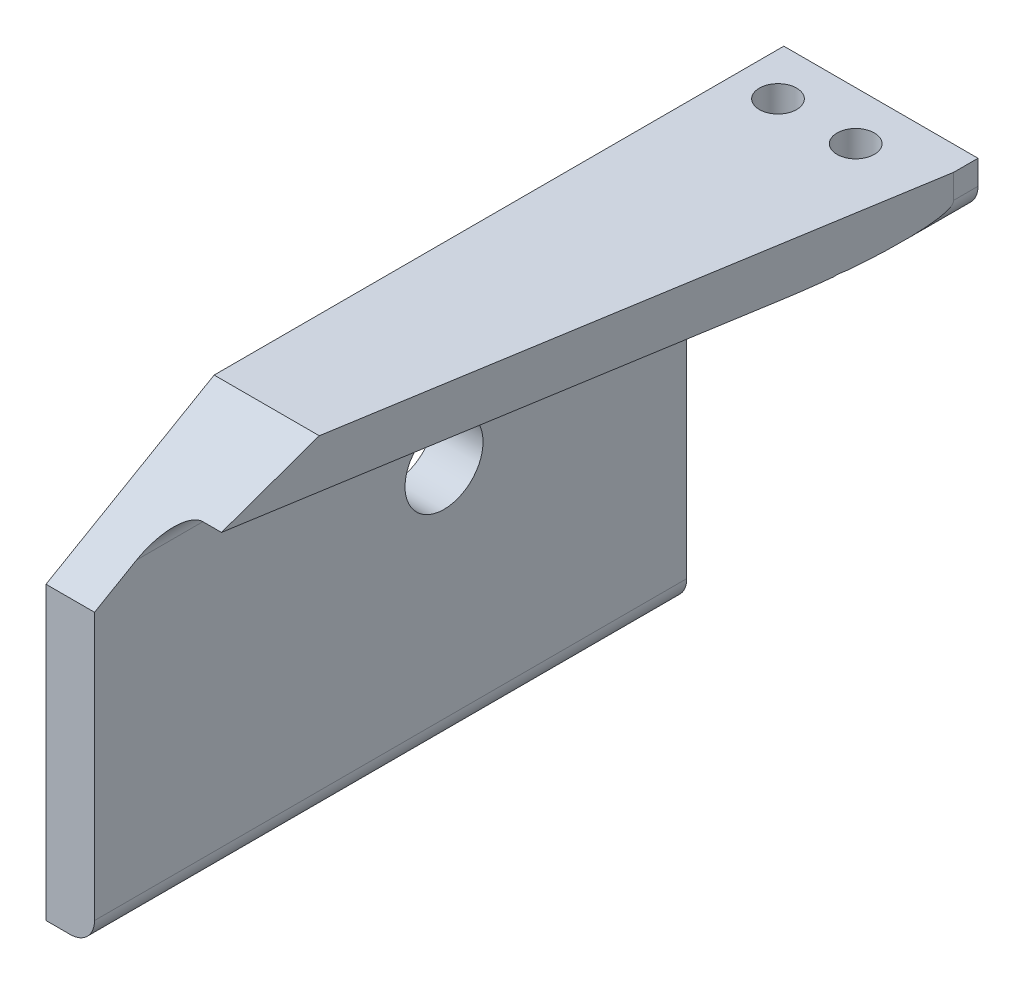
ISO-10303-21;
HEADER;
FILE_DESCRIPTION(('STEP AP214'),'2;1');
FILE_NAME('part.step','',(''),(''),'','','');
FILE_SCHEMA(('AUTOMOTIVE_DESIGN { 1 0 10303 214 1 1 1 1 }'));
ENDSEC;
DATA;
#1=APPLICATION_CONTEXT('core data for automotive mechanical design processes');
#2=APPLICATION_PROTOCOL_DEFINITION('international standard','automotive_design',2000,#1);
#3=PRODUCT_CONTEXT('',#1,'mechanical');
#4=PRODUCT('Part','Part','',(#3));
#5=PRODUCT_RELATED_PRODUCT_CATEGORY('part','',(#4));
#6=PRODUCT_DEFINITION_FORMATION('','',#4);
#7=PRODUCT_DEFINITION_CONTEXT('part definition',#1,'design');
#8=PRODUCT_DEFINITION('design','',#6,#7);
#9=PRODUCT_DEFINITION_SHAPE('','',#8);
#10=(LENGTH_UNIT() NAMED_UNIT(*) SI_UNIT(.MILLI.,.METRE.));
#11=(NAMED_UNIT(*) PLANE_ANGLE_UNIT() SI_UNIT($,.RADIAN.));
#12=(NAMED_UNIT(*) SI_UNIT($,.STERADIAN.) SOLID_ANGLE_UNIT());
#13=UNCERTAINTY_MEASURE_WITH_UNIT(LENGTH_MEASURE(1.E-05),#10,'distance_accuracy_value','');
#14=(GEOMETRIC_REPRESENTATION_CONTEXT(3) GLOBAL_UNCERTAINTY_ASSIGNED_CONTEXT((#13)) GLOBAL_UNIT_ASSIGNED_CONTEXT((#10,
#11,#12)) REPRESENTATION_CONTEXT('',''));
#15=CARTESIAN_POINT('',(0.,0.,0.));
#16=DIRECTION('',(0.,0.,1.));
#17=DIRECTION('',(1.,0.,0.));
#18=AXIS2_PLACEMENT_3D('',#15,#16,#17);
#19=CARTESIAN_POINT('',(11.1125,-1.5875,48.26));
#20=DIRECTION('',(0.,0.,-1.));
#21=DIRECTION('',(-1.,0.,0.));
#22=AXIS2_PLACEMENT_3D('',#19,#20,#21);
#23=CYLINDRICAL_SURFACE('',#22,1.5875);
#24=DIRECTION('',(0.,0.,-1.));
#25=VECTOR('',#24,1.);
#26=CARTESIAN_POINT('',(12.7,-1.5875,48.26));
#27=LINE('',#26,#25);
#28=CARTESIAN_POINT('',(12.7,-1.5875,1.5875));
#29=VERTEX_POINT('',#28);
#30=CARTESIAN_POINT('',(12.7,-1.5875,0.));
#31=VERTEX_POINT('',#30);
#32=EDGE_CURVE('E167',#29,#31,#27,.T.);
#33=ORIENTED_EDGE('',*,*,#32,.F.);
#34=CARTESIAN_POINT('',(11.1125,-1.5875,11.3109375));
#35=DIRECTION('',(-0.986932880775682,0.,-0.161131898902152));
#36=DIRECTION('',(0.161131898902152,0.,-0.986932880775682));
#37=AXIS2_PLACEMENT_3D('',#34,#35,#36);
#38=ELLIPSE('',#37,9.85217707242447,1.5875);
#39=CARTESIAN_POINT('',(11.7346703946669,-3.048,7.50014383266502));
#40=VERTEX_POINT('',#39);
#41=EDGE_CURVE('E148',#29,#40,#38,.T.);
#42=ORIENTED_EDGE('',*,*,#41,.T.);
#43=DIRECTION('',(0.,0.,-1.));
#44=VECTOR('',#43,1.);
#45=CARTESIAN_POINT('',(11.7346703946669,-3.04800000000001,48.26));
#46=LINE('',#45,#44);
#47=CARTESIAN_POINT('',(11.7346703946669,-3.048,0.));
#48=VERTEX_POINT('',#47);
#49=EDGE_CURVE('E270',#48,#40,#46,.F.);
#50=ORIENTED_EDGE('',*,*,#49,.F.);
#51=CARTESIAN_POINT('',(11.1125,-1.5875,0.));
#52=DIRECTION('',(0.,0.,1.));
#53=DIRECTION('',(1.,0.,0.));
#54=AXIS2_PLACEMENT_3D('',#51,#52,#53);
#55=CIRCLE('',#54,1.5875);
#56=EDGE_CURVE('E269',#48,#31,#55,.T.);
#57=ORIENTED_EDGE('',*,*,#56,.T.);
#58=EDGE_LOOP('',(#33,#42,#50,#57));
#59=FACE_BOUND('',#58,.T.);
#60=ADVANCED_FACE('F36',(#59),#23,.T.);
#61=CARTESIAN_POINT('',(0.,0.,48.26));
#62=DIRECTION('',(1.,0.,0.));
#63=DIRECTION('',(0.,1.,0.));
#64=AXIS2_PLACEMENT_3D('',#61,#62,#63);
#65=PLANE('',#64);
#66=CARTESIAN_POINT('',(0.,-9.398,25.4));
#67=DIRECTION('',(-1.,0.,0.));
#68=DIRECTION('',(0.,-1.,0.));
#69=AXIS2_PLACEMENT_3D('',#66,#67,#68);
#70=CIRCLE('',#69,2.5527);
#71=CARTESIAN_POINT('',(0.,-11.9507,25.4));
#72=VERTEX_POINT('',#71);
#73=EDGE_CURVE('E335',#72,#72,#70,.T.);
#74=ORIENTED_EDGE('',*,*,#73,.F.);
#75=EDGE_LOOP('',(#74));
#76=FACE_BOUND('',#75,.T.);
#77=DIRECTION('',(0.,-1.,0.));
#78=VECTOR('',#77,1.);
#79=CARTESIAN_POINT('',(0.,0.,48.26));
#80=LINE('',#79,#78);
#81=CARTESIAN_POINT('',(0.,-6.35000000000001,48.26));
#82=VERTEX_POINT('',#81);
#83=CARTESIAN_POINT('',(0.,-25.4,48.26));
#84=VERTEX_POINT('',#83);
#85=EDGE_CURVE('E276',#82,#84,#80,.T.);
#86=ORIENTED_EDGE('',*,*,#85,.F.);
#87=DIRECTION('',(0.,0.500000000000001,-0.866025403784438));
#88=VECTOR('',#87,1.);
#89=CARTESIAN_POINT('',(0.,-6.35000000000001,48.26));
#90=LINE('',#89,#88);
#91=CARTESIAN_POINT('',(0.,0.,37.2614773719376));
#92=VERTEX_POINT('',#91);
#93=EDGE_CURVE('E295',#82,#92,#90,.T.);
#94=ORIENTED_EDGE('',*,*,#93,.T.);
#95=DIRECTION('',(0.,0.,-1.));
#96=VECTOR('',#95,1.);
#97=CARTESIAN_POINT('',(0.,0.,48.26));
#98=LINE('',#97,#96);
#99=CARTESIAN_POINT('',(0.,0.,0.));
#100=VERTEX_POINT('',#99);
#101=EDGE_CURVE('E192',#92,#100,#98,.T.);
#102=ORIENTED_EDGE('',*,*,#101,.T.);
#103=DIRECTION('',(0.,-1.,0.));
#104=VECTOR('',#103,1.);
#105=CARTESIAN_POINT('',(0.,0.,0.));
#106=LINE('',#105,#104);
#107=CARTESIAN_POINT('',(0.,-3.048,0.));
#108=VERTEX_POINT('',#107);
#109=EDGE_CURVE('E273',#100,#108,#106,.T.);
#110=ORIENTED_EDGE('',*,*,#109,.T.);
#111=DIRECTION('',(0.,0.,1.));
#112=VECTOR('',#111,1.);
#113=CARTESIAN_POINT('',(0.,-3.048,0.));
#114=LINE('',#113,#112);
#115=CARTESIAN_POINT('',(0.,-3.048,7.9375));
#116=VERTEX_POINT('',#115);
#117=EDGE_CURVE('E204',#108,#116,#114,.T.);
#118=ORIENTED_EDGE('',*,*,#117,.T.);
#119=CARTESIAN_POINT('',(0.,-4.6355,7.9375));
#120=DIRECTION('',(1.,0.,0.));
#121=DIRECTION('',(0.,1.,0.));
#122=AXIS2_PLACEMENT_3D('',#119,#120,#121);
#123=CIRCLE('',#122,1.5875);
#124=CARTESIAN_POINT('',(0.,-4.6355,9.525));
#125=VERTEX_POINT('',#124);
#126=EDGE_CURVE('E208',#116,#125,#123,.T.);
#127=ORIENTED_EDGE('',*,*,#126,.T.);
#128=DIRECTION('',(0.,-1.,0.));
#129=VECTOR('',#128,1.);
#130=CARTESIAN_POINT('',(0.,-25.4,9.525));
#131=LINE('',#130,#129);
#132=CARTESIAN_POINT('',(0.,-25.4,9.525));
#133=VERTEX_POINT('',#132);
#134=EDGE_CURVE('E327',#125,#133,#131,.T.);
#135=ORIENTED_EDGE('',*,*,#134,.T.);
#136=DIRECTION('',(0.,0.,-1.));
#137=VECTOR('',#136,1.);
#138=CARTESIAN_POINT('',(0.,-25.4,48.26));
#139=LINE('',#138,#137);
#140=EDGE_CURVE('E189',#84,#133,#139,.T.);
#141=ORIENTED_EDGE('',*,*,#140,.F.);
#142=EDGE_LOOP('',(#86,#94,#102,#110,#118,#127,#135,#141));
#143=FACE_BOUND('',#142,.T.);
#144=ADVANCED_FACE('F258',(#76,#143),#65,.F.);
#145=CARTESIAN_POINT('',(0.,-25.4,48.26));
#146=DIRECTION('',(0.,1.,0.));
#147=DIRECTION('',(0.,0.,1.));
#148=AXIS2_PLACEMENT_3D('',#145,#146,#147);
#149=PLANE('',#148);
#150=DIRECTION('',(-1.,0.,0.));
#151=VECTOR('',#150,1.);
#152=CARTESIAN_POINT('',(12.7,-25.4,9.525));
#153=LINE('',#152,#151);
#154=CARTESIAN_POINT('',(1.5875,-25.4,9.525));
#155=VERTEX_POINT('',#154);
#156=EDGE_CURVE('E322',#155,#133,#153,.T.);
#157=ORIENTED_EDGE('',*,*,#156,.F.);
#158=DIRECTION('',(0.,0.,-1.));
#159=VECTOR('',#158,1.);
#160=CARTESIAN_POINT('',(1.5875,-25.4,48.26));
#161=LINE('',#160,#159);
#162=CARTESIAN_POINT('',(1.5875,-25.4,48.26));
#163=VERTEX_POINT('',#162);
#164=EDGE_CURVE('E186',#163,#155,#161,.T.);
#165=ORIENTED_EDGE('',*,*,#164,.F.);
#166=DIRECTION('',(1.,0.,0.));
#167=VECTOR('',#166,1.);
#168=CARTESIAN_POINT('',(0.,-25.4,48.26));
#169=LINE('',#168,#167);
#170=EDGE_CURVE('E277',#84,#163,#169,.T.);
#171=ORIENTED_EDGE('',*,*,#170,.F.);
#172=ORIENTED_EDGE('',*,*,#140,.T.);
#173=EDGE_LOOP('',(#157,#165,#171,#172));
#174=FACE_BOUND('',#173,.T.);
#175=ADVANCED_FACE('F263',(#174),#149,.F.);
#176=CARTESIAN_POINT('',(1.5875,-23.8125,48.26));
#177=DIRECTION('',(0.,0.,-1.));
#178=DIRECTION('',(-1.,0.,0.));
#179=AXIS2_PLACEMENT_3D('',#176,#177,#178);
#180=CYLINDRICAL_SURFACE('',#179,1.5875);
#181=CARTESIAN_POINT('',(1.5875,-23.8125,9.525));
#182=DIRECTION('',(0.,0.,-1.));
#183=DIRECTION('',(-1.,0.,0.));
#184=AXIS2_PLACEMENT_3D('',#181,#182,#183);
#185=CIRCLE('',#184,1.5875);
#186=CARTESIAN_POINT('',(3.175,-23.8125,9.525));
#187=VERTEX_POINT('',#186);
#188=EDGE_CURVE('E285',#187,#155,#185,.T.);
#189=ORIENTED_EDGE('',*,*,#188,.F.);
#190=DIRECTION('',(0.,0.,-1.));
#191=VECTOR('',#190,1.);
#192=CARTESIAN_POINT('',(3.175,-23.8125,48.26));
#193=LINE('',#192,#191);
#194=CARTESIAN_POINT('',(3.175,-23.8125,48.26));
#195=VERTEX_POINT('',#194);
#196=EDGE_CURVE('E183',#195,#187,#193,.T.);
#197=ORIENTED_EDGE('',*,*,#196,.F.);
#198=CARTESIAN_POINT('',(1.5875,-23.8125,48.26));
#199=DIRECTION('',(0.,0.,1.));
#200=DIRECTION('',(1.,0.,0.));
#201=AXIS2_PLACEMENT_3D('',#198,#199,#200);
#202=CIRCLE('',#201,1.5875);
#203=EDGE_CURVE('E173',#163,#195,#202,.T.);
#204=ORIENTED_EDGE('',*,*,#203,.F.);
#205=ORIENTED_EDGE('',*,*,#164,.T.);
#206=EDGE_LOOP('',(#189,#197,#204,#205));
#207=FACE_BOUND('',#206,.T.);
#208=ADVANCED_FACE('F356',(#207),#180,.T.);
#209=CARTESIAN_POINT('',(3.175,-23.8125,48.26));
#210=DIRECTION('',(-1.,0.,0.));
#211=DIRECTION('',(0.,-1.,0.));
#212=AXIS2_PLACEMENT_3D('',#209,#210,#211);
#213=PLANE('',#212);
#214=CARTESIAN_POINT('',(3.175,-9.398,25.4));
#215=DIRECTION('',(-1.,0.,0.));
#216=DIRECTION('',(0.,-1.,0.));
#217=AXIS2_PLACEMENT_3D('',#214,#215,#216);
#218=CIRCLE('',#217,2.5527);
#219=CARTESIAN_POINT('',(3.175,-11.9507,25.4));
#220=VERTEX_POINT('',#219);
#221=EDGE_CURVE('E242',#220,#220,#218,.T.);
#222=ORIENTED_EDGE('',*,*,#221,.T.);
#223=EDGE_LOOP('',(#222));
#224=FACE_BOUND('',#223,.T.);
#225=DIRECTION('',(0.,0.,-1.));
#226=VECTOR('',#225,1.);
#227=CARTESIAN_POINT('',(3.175,-4.76250000000001,48.26));
#228=LINE('',#227,#226);
#229=CARTESIAN_POINT('',(3.175,-4.76250000000001,45.5103693429844));
#230=VERTEX_POINT('',#229);
#231=CARTESIAN_POINT('',(3.175,-4.7625,9.525));
#232=VERTEX_POINT('',#231);
#233=EDGE_CURVE('E181',#230,#232,#228,.T.);
#234=ORIENTED_EDGE('',*,*,#233,.F.);
#235=DIRECTION('',(0.,-0.500000000000001,0.866025403784438));
#236=VECTOR('',#235,1.);
#237=CARTESIAN_POINT('',(3.175,-6.35000000000001,48.26));
#238=LINE('',#237,#236);
#239=CARTESIAN_POINT('',(3.175,-6.35000000000002,48.26));
#240=VERTEX_POINT('',#239);
#241=EDGE_CURVE('E11',#230,#240,#238,.T.);
#242=ORIENTED_EDGE('',*,*,#241,.T.);
#243=DIRECTION('',(0.,1.,0.));
#244=VECTOR('',#243,1.);
#245=CARTESIAN_POINT('',(3.175,-23.8125,48.26));
#246=LINE('',#245,#244);
#247=EDGE_CURVE('E168',#195,#240,#246,.T.);
#248=ORIENTED_EDGE('',*,*,#247,.F.);
#249=ORIENTED_EDGE('',*,*,#196,.T.);
#250=DIRECTION('',(0.,-1.,0.));
#251=VECTOR('',#250,1.);
#252=CARTESIAN_POINT('',(3.175,-23.8125,9.525));
#253=LINE('',#252,#251);
#254=EDGE_CURVE('E320',#232,#187,#253,.T.);
#255=ORIENTED_EDGE('',*,*,#254,.F.);
#256=EDGE_LOOP('',(#234,#242,#248,#249,#255));
#257=FACE_BOUND('',#256,.T.);
#258=ADVANCED_FACE('F256',(#224,#257),#213,.F.);
#259=CARTESIAN_POINT('',(4.7625,-4.7625,48.26));
#260=DIRECTION('',(0.,0.,-1.));
#261=DIRECTION('',(-1.,0.,0.));
#262=AXIS2_PLACEMENT_3D('',#259,#260,#261);
#263=CYLINDRICAL_SURFACE('',#262,1.5875);
#264=DIRECTION('',(0.,0.,-1.));
#265=VECTOR('',#264,1.);
#266=CARTESIAN_POINT('',(4.76250000000002,-3.175,48.26));
#267=LINE('',#266,#265);
#268=CARTESIAN_POINT('',(4.76250000000002,-3.175,42.7607386859688));
#269=VERTEX_POINT('',#268);
#270=CARTESIAN_POINT('',(4.76250000000002,-3.175,8.55967039466694));
#271=VERTEX_POINT('',#270);
#272=EDGE_CURVE('E179',#269,#271,#267,.T.);
#273=ORIENTED_EDGE('',*,*,#272,.F.);
#274=CARTESIAN_POINT('',(4.7625,-4.7625,45.5103693429844));
#275=DIRECTION('',(0.,0.866025403784438,0.500000000000001));
#276=DIRECTION('',(0.,0.500000000000001,-0.866025403784438));
#277=AXIS2_PLACEMENT_3D('',#274,#275,#276);
#278=ELLIPSE('',#277,3.17499999999999,1.5875);
#279=EDGE_CURVE('E44',#269,#230,#278,.T.);
#280=ORIENTED_EDGE('',*,*,#279,.T.);
#281=ORIENTED_EDGE('',*,*,#233,.T.);
#282=CARTESIAN_POINT('',(4.7625,-4.7625,9.525));
#283=DIRECTION('',(0.,0.,-1.));
#284=DIRECTION('',(-1.,0.,0.));
#285=AXIS2_PLACEMENT_3D('',#282,#283,#284);
#286=CIRCLE('',#285,1.5875);
#287=CARTESIAN_POINT('',(3.18008815411411,-4.6355,9.525));
#288=VERTEX_POINT('',#287);
#289=EDGE_CURVE('E317',#288,#232,#286,.F.);
#290=ORIENTED_EDGE('',*,*,#289,.F.);
#291=CARTESIAN_POINT('',(3.18008815411411,-4.6355,9.525));
#292=CARTESIAN_POINT('',(3.18299969016039,-4.59910669118079,9.52500905857327));
#293=CARTESIAN_POINT('',(3.18718396128578,-4.56282585753173,9.52374889970769));
#294=CARTESIAN_POINT('',(3.19799726621211,-4.49083234252779,9.5188033979529));
#295=CARTESIAN_POINT('',(3.20462392383905,-4.45511914403599,9.51512040948669));
#296=CARTESIAN_POINT('',(3.22015733991338,-4.3848488430333,9.5054854895611));
#297=CARTESIAN_POINT('',(3.2290431138941,-4.35028424412064,9.49955420566506));
#298=CARTESIAN_POINT('',(3.2489769650991,-4.28222577740587,9.48558333922453));
#299=CARTESIAN_POINT('',(3.26002546926726,-4.24873212253971,9.47754334029261));
#300=CARTESIAN_POINT('',(3.29608789627414,-4.15042122048713,9.45059260366214));
#301=CARTESIAN_POINT('',(3.32409229912281,-4.0874501347726,9.42880407933441));
#302=CARTESIAN_POINT('',(3.38674857361639,-3.96747044163987,9.37907435994791));
#303=CARTESIAN_POINT('',(3.42141619724842,-3.91047646780299,9.35111856171302));
#304=CARTESIAN_POINT('',(3.51254754473182,-3.77931852082322,9.27726834220993));
#305=CARTESIAN_POINT('',(3.57190790034951,-3.70856530558468,9.2288794095193));
#306=CARTESIAN_POINT('',(3.6992479814193,-3.58018518898879,9.12630446381757));
#307=CARTESIAN_POINT('',(3.76724848139078,-3.52259089343186,9.07210452948615));
#308=CARTESIAN_POINT('',(3.91251197419389,-3.41866709489255,8.95996030561063));
#309=CARTESIAN_POINT('',(3.98997491567636,-3.37268227381185,8.90195451349636));
#310=CARTESIAN_POINT('',(4.11231820617862,-3.31354909537488,8.81716010189498));
#311=CARTESIAN_POINT('',(4.1541208635103,-3.29547966443082,8.78926628559767));
#312=CARTESIAN_POINT('',(4.2401472434245,-3.26269199869688,8.735335918464));
#313=CARTESIAN_POINT('',(4.28436821660284,-3.24797005249206,8.70929733292122));
#314=CARTESIAN_POINT('',(4.37118616821967,-3.2233908455973,8.66325178431324));
#315=CARTESIAN_POINT('',(4.41350079251016,-3.21319366251407,8.64290175841163));
#316=CARTESIAN_POINT('',(4.50066813312124,-3.19611851443939,8.60736832938853));
#317=CARTESIAN_POINT('',(4.54550050732693,-3.18921730651889,8.59214897636254));
#318=CARTESIAN_POINT('',(4.61925149503043,-3.18123179225361,8.57414753523792));
#319=CARTESIAN_POINT('',(4.64740523251804,-3.17892558851569,8.56882627265385));
#320=CARTESIAN_POINT('',(4.70451255775351,-3.17579558128397,8.56153924282238));
#321=CARTESIAN_POINT('',(4.7334714121804,-3.17498739684783,8.55960884104382));
#322=CARTESIAN_POINT('',(4.76250000000002,-3.175,8.55967039466693));
#323=B_SPLINE_CURVE_WITH_KNOTS('',3,(#291,#292,#293,#294,#295,#296,#297,#298,#299,#300,#301,
#302,#303,#304,#305,#306,#307,#308,#309,#310,#311,#312,#313,#314,#315,#316,#317,#318,#319,#320,
#321,#322),.UNSPECIFIED.,.F.,.F.,(4,2,2,2,2,2,2,2,2,2,2,2,2,2,2,4),(0.,0.109468787937303,
0.218831354678395,0.327212995019186,0.435616052561599,0.651429097511819,0.867758747423664,
1.17882272359275,1.49064930601214,1.81086365818976,1.97094763074745,2.13085324043492,
2.27471207072506,2.41754086760969,2.50354602075871,2.59044296669996),.UNSPECIFIED.);
#324=EDGE_CURVE('E210',#288,#271,#323,.T.);
#325=ORIENTED_EDGE('',*,*,#324,.T.);
#326=EDGE_LOOP('',(#273,#280,#281,#290,#325));
#327=FACE_BOUND('',#326,.T.);
#328=ADVANCED_FACE('F220',(#327),#263,.F.);
#329=CARTESIAN_POINT('',(4.76250000000002,-3.175,48.26));
#330=DIRECTION('',(0.,1.,0.));
#331=DIRECTION('',(-1.,0.,0.));
#332=AXIS2_PLACEMENT_3D('',#329,#330,#331);
#333=PLANE('',#332);
#334=DIRECTION('',(-0.161131898902152,0.,0.986932880775682));
#335=VECTOR('',#334,1.);
#336=CARTESIAN_POINT('',(5.0717565922921,-3.175,48.3104908722109));
#337=LINE('',#336,#335);
#338=CARTESIAN_POINT('',(11.1125,-3.175,11.3109375000001));
#339=VERTEX_POINT('',#338);
#340=CARTESIAN_POINT('',(5.97783858188265,-3.175,42.7607386859688));
#341=VERTEX_POINT('',#340);
#342=EDGE_CURVE('E338',#339,#341,#337,.T.);
#343=ORIENTED_EDGE('',*,*,#342,.T.);
#344=DIRECTION('',(-1.,0.,0.));
#345=VECTOR('',#344,1.);
#346=CARTESIAN_POINT('',(1.5875,-3.175,42.7607386859688));
#347=LINE('',#346,#345);
#348=EDGE_CURVE('E58',#341,#269,#347,.T.);
#349=ORIENTED_EDGE('',*,*,#348,.T.);
#350=ORIENTED_EDGE('',*,*,#272,.T.);
#351=DIRECTION('',(1.,0.,0.));
#352=VECTOR('',#351,1.);
#353=CARTESIAN_POINT('',(4.76250000000002,-3.175,8.55967039466693));
#354=LINE('',#353,#352);
#355=CARTESIAN_POINT('',(11.1125,-3.175,8.55967039466694));
#356=VERTEX_POINT('',#355);
#357=EDGE_CURVE('E218',#271,#356,#354,.T.);
#358=ORIENTED_EDGE('',*,*,#357,.T.);
#359=DIRECTION('',(0.,0.,-1.));
#360=VECTOR('',#359,1.);
#361=CARTESIAN_POINT('',(11.1125,-3.175,48.26));
#362=LINE('',#361,#360);
#363=EDGE_CURVE('E170',#339,#356,#362,.T.);
#364=ORIENTED_EDGE('',*,*,#363,.F.);
#365=EDGE_LOOP('',(#343,#349,#350,#358,#364));
#366=FACE_BOUND('',#365,.T.);
#367=ADVANCED_FACE('F249',(#366),#333,.F.);
#368=CARTESIAN_POINT('',(11.1125,-3.175,8.55967039466693));
#369=CARTESIAN_POINT('',(11.1471262227522,-3.17503959726303,8.55968141225063));
#370=CARTESIAN_POINT('',(11.1817503343849,-3.17386848151595,8.55701250692908));
#371=CARTESIAN_POINT('',(11.2500306589705,-3.16939076130113,8.54638443688477));
#372=CARTESIAN_POINT('',(11.2836869993394,-3.16608443931033,8.53842597193982));
#373=CARTESIAN_POINT('',(11.3491062153964,-3.15761842235418,8.51727914115392));
#374=CARTESIAN_POINT('',(11.380867418404,-3.15245711755943,8.5040862316124));
#375=CARTESIAN_POINT('',(11.4415237589996,-3.14083548945272,8.47267766377965));
#376=CARTESIAN_POINT('',(11.4704203099945,-3.13437581156377,8.45446449939988));
#377=CARTESIAN_POINT('',(11.5242886719128,-3.12091201684851,8.41356378509603));
#378=CARTESIAN_POINT('',(11.5492929288092,-3.11391321947326,8.39091722523908));
#379=CARTESIAN_POINT('',(11.5950212250485,-3.10008110234245,8.34160320255339));
#380=CARTESIAN_POINT('',(11.6157448316477,-3.09324779937879,8.31493533366949));
#381=CARTESIAN_POINT('',(11.6522722904562,-3.08054200352724,8.25857313438843));
#382=CARTESIAN_POINT('',(11.668118444932,-3.07466147156984,8.2289079734433));
#383=CARTESIAN_POINT('',(11.6948670798011,-3.06439216247328,8.16718411130278));
#384=CARTESIAN_POINT('',(11.7057696479101,-3.06000335886623,8.13512545258776));
#385=CARTESIAN_POINT('',(11.7209690598668,-3.05378052995644,8.0755055777159));
#386=CARTESIAN_POINT('',(11.7261069948296,-3.05162691482724,8.04818769985961));
#387=CARTESIAN_POINT('',(11.7329568509944,-3.04872972124624,7.99308205866718));
#388=CARTESIAN_POINT('',(11.7346724438758,-3.04798463169472,7.96529483119938));
#389=CARTESIAN_POINT('',(11.7346703946669,-3.048,7.93750000000001));
#390=B_SPLINE_CURVE_WITH_KNOTS('',3,(#368,#369,#370,#371,#372,#373,#374,#375,#376,#377,#378,
#379,#380,#381,#382,#383,#384,#385,#386,#387,#388,#389),.UNSPECIFIED.,.F.,.F.,(4,2,2,2,2,2,2,2,
2,2,4),(0.,0.103754418317,0.207495113262279,0.311326056855447,0.41510551303454,0.51796727277783,
0.620839426040086,0.722792445692612,0.824743656287801,0.908140289098449,0.991447401132246),.UNSPECIFIED.);
#391=CARTESIAN_POINT('',(11.598170475986,-3.09888361733727,8.33620583458548));
#392=VERTEX_POINT('',#391);
#393=EDGE_CURVE('E233',#356,#392,#390,.T.);
#394=ORIENTED_EDGE('',*,*,#393,.T.);
#395=EDGE_CURVE('E310',#392,#339,#38,.T.);
#396=ORIENTED_EDGE('',*,*,#395,.T.);
#397=ORIENTED_EDGE('',*,*,#363,.T.);
#398=EDGE_LOOP('',(#394,#396,#397));
#399=FACE_BOUND('',#398,.T.);
#400=ADVANCED_FACE('F244',(#399),#23,.T.);
#401=CARTESIAN_POINT('',(1.5875,-23.8125,0.));
#402=DIRECTION('',(0.,0.,1.));
#403=DIRECTION('',(1.,0.,0.));
#404=AXIS2_PLACEMENT_3D('',#401,#402,#403);
#405=PLANE('',#404);
#406=DIRECTION('',(1.,0.,0.));
#407=VECTOR('',#406,1.);
#408=CARTESIAN_POINT('',(1.5875,-3.048,0.));
#409=LINE('',#408,#407);
#410=EDGE_CURVE('E194',#108,#48,#409,.T.);
#411=ORIENTED_EDGE('',*,*,#410,.F.);
#412=ORIENTED_EDGE('',*,*,#109,.F.);
#413=DIRECTION('',(-1.,0.,0.));
#414=VECTOR('',#413,1.);
#415=CARTESIAN_POINT('',(12.7,0.,0.));
#416=LINE('',#415,#414);
#417=CARTESIAN_POINT('',(12.7,0.,0.));
#418=VERTEX_POINT('',#417);
#419=EDGE_CURVE('E275',#418,#100,#416,.T.);
#420=ORIENTED_EDGE('',*,*,#419,.F.);
#421=DIRECTION('',(0.,1.,0.));
#422=VECTOR('',#421,1.);
#423=CARTESIAN_POINT('',(12.7,-1.58749999999999,0.));
#424=LINE('',#423,#422);
#425=EDGE_CURVE('E165',#31,#418,#424,.T.);
#426=ORIENTED_EDGE('',*,*,#425,.F.);
#427=ORIENTED_EDGE('',*,*,#56,.F.);
#428=EDGE_LOOP('',(#411,#412,#420,#426,#427));
#429=FACE_BOUND('',#428,.T.);
#430=ADVANCED_FACE('F248',(#429),#405,.F.);
#431=CARTESIAN_POINT('',(12.7,0.,48.26));
#432=DIRECTION('',(0.,-1.,0.));
#433=DIRECTION('',(1.,0.,0.));
#434=AXIS2_PLACEMENT_3D('',#431,#432,#433);
#435=PLANE('',#434);
#436=CARTESIAN_POINT('',(2.794,0.,3.175));
#437=DIRECTION('',(0.,1.,0.));
#438=DIRECTION('',(-1.,0.,0.));
#439=AXIS2_PLACEMENT_3D('',#436,#437,#438);
#440=CIRCLE('',#439,1.2192);
#441=CARTESIAN_POINT('',(1.5748,0.,3.175));
#442=VERTEX_POINT('',#441);
#443=EDGE_CURVE('E201',#442,#442,#440,.T.);
#444=ORIENTED_EDGE('',*,*,#443,.F.);
#445=EDGE_LOOP('',(#444));
#446=FACE_BOUND('',#445,.T.);
#447=CARTESIAN_POINT('',(7.874,0.,3.175));
#448=DIRECTION('',(0.,1.,0.));
#449=DIRECTION('',(-1.,0.,0.));
#450=AXIS2_PLACEMENT_3D('',#447,#448,#449);
#451=CIRCLE('',#450,1.2192);
#452=CARTESIAN_POINT('',(6.6548,0.,3.175));
#453=VERTEX_POINT('',#452);
#454=EDGE_CURVE('E330',#453,#453,#451,.T.);
#455=ORIENTED_EDGE('',*,*,#454,.F.);
#456=EDGE_LOOP('',(#455));
#457=FACE_BOUND('',#456,.T.);
#458=ORIENTED_EDGE('',*,*,#101,.F.);
#459=DIRECTION('',(1.,0.,0.));
#460=VECTOR('',#459,1.);
#461=CARTESIAN_POINT('',(5.08000000000001,0.,37.2614773719376));
#462=LINE('',#461,#460);
#463=CARTESIAN_POINT('',(6.87567716376529,0.,37.2614773719376));
#464=VERTEX_POINT('',#463);
#465=EDGE_CURVE('E161',#92,#464,#462,.T.);
#466=ORIENTED_EDGE('',*,*,#465,.T.);
#467=DIRECTION('',(-0.161131898902152,0.,0.986932880775682));
#468=VECTOR('',#467,1.);
#469=CARTESIAN_POINT('',(5.08000000000001,0.,48.26));
#470=LINE('',#469,#468);
#471=CARTESIAN_POINT('',(12.7,0.,1.5875));
#472=VERTEX_POINT('',#471);
#473=EDGE_CURVE('E145',#472,#464,#470,.T.);
#474=ORIENTED_EDGE('',*,*,#473,.F.);
#475=DIRECTION('',(0.,0.,-1.));
#476=VECTOR('',#475,1.);
#477=CARTESIAN_POINT('',(12.7,0.,48.26));
#478=LINE('',#477,#476);
#479=EDGE_CURVE('E158',#472,#418,#478,.T.);
#480=ORIENTED_EDGE('',*,*,#479,.T.);
#481=ORIENTED_EDGE('',*,*,#419,.T.);
#482=EDGE_LOOP('',(#458,#466,#474,#480,#481));
#483=FACE_BOUND('',#482,.T.);
#484=ADVANCED_FACE('F156',(#446,#457,#483),#435,.F.);
#485=CARTESIAN_POINT('',(12.7,-1.58749999999999,48.26));
#486=DIRECTION('',(-1.,0.,0.));
#487=DIRECTION('',(0.,0.,1.));
#488=AXIS2_PLACEMENT_3D('',#485,#486,#487);
#489=PLANE('',#488);
#490=ORIENTED_EDGE('',*,*,#479,.F.);
#491=DIRECTION('',(0.,1.,0.));
#492=VECTOR('',#491,1.);
#493=CARTESIAN_POINT('',(12.7,-25.4,1.5875));
#494=LINE('',#493,#492);
#495=EDGE_CURVE('E142',#29,#472,#494,.T.);
#496=ORIENTED_EDGE('',*,*,#495,.F.);
#497=ORIENTED_EDGE('',*,*,#32,.T.);
#498=ORIENTED_EDGE('',*,*,#425,.T.);
#499=EDGE_LOOP('',(#490,#496,#497,#498));
#500=FACE_BOUND('',#499,.T.);
#501=ADVANCED_FACE('F163',(#500),#489,.F.);
#502=CARTESIAN_POINT('',(1.5875,-23.8125,48.26));
#503=DIRECTION('',(0.,0.,1.));
#504=DIRECTION('',(1.,0.,0.));
#505=AXIS2_PLACEMENT_3D('',#502,#503,#504);
#506=PLANE('',#505);
#507=ORIENTED_EDGE('',*,*,#247,.T.);
#508=DIRECTION('',(-1.,0.,0.));
#509=VECTOR('',#508,1.);
#510=CARTESIAN_POINT('',(0.,-6.35000000000001,48.26));
#511=LINE('',#510,#509);
#512=EDGE_CURVE('E299',#240,#82,#511,.T.);
#513=ORIENTED_EDGE('',*,*,#512,.T.);
#514=ORIENTED_EDGE('',*,*,#85,.T.);
#515=ORIENTED_EDGE('',*,*,#170,.T.);
#516=ORIENTED_EDGE('',*,*,#203,.T.);
#517=EDGE_LOOP('',(#507,#513,#514,#515,#516));
#518=FACE_BOUND('',#517,.T.);
#519=ADVANCED_FACE('F352',(#518),#506,.T.);
#520=CARTESIAN_POINT('',(12.7,-25.4,9.525));
#521=DIRECTION('',(0.,0.,-1.));
#522=DIRECTION('',(-1.,0.,0.));
#523=AXIS2_PLACEMENT_3D('',#520,#521,#522);
#524=PLANE('',#523);
#525=ORIENTED_EDGE('',*,*,#134,.F.);
#526=DIRECTION('',(-1.,0.,0.));
#527=VECTOR('',#526,1.);
#528=CARTESIAN_POINT('',(11.7346703946669,-4.6355,9.525));
#529=LINE('',#528,#527);
#530=EDGE_CURVE('E206',#125,#288,#529,.F.);
#531=ORIENTED_EDGE('',*,*,#530,.T.);
#532=ORIENTED_EDGE('',*,*,#289,.T.);
#533=ORIENTED_EDGE('',*,*,#254,.T.);
#534=ORIENTED_EDGE('',*,*,#188,.T.);
#535=ORIENTED_EDGE('',*,*,#156,.T.);
#536=EDGE_LOOP('',(#525,#531,#532,#533,#534,#535));
#537=FACE_BOUND('',#536,.T.);
#538=ADVANCED_FACE('F345',(#537),#524,.T.);
#539=CARTESIAN_POINT('',(12.7,-3.048,0.));
#540=DIRECTION('',(0.,-1.,0.));
#541=DIRECTION('',(0.,0.,-1.));
#542=AXIS2_PLACEMENT_3D('',#539,#540,#541);
#543=PLANE('',#542);
#544=DIRECTION('',(0.161131898902152,0.,-0.986932880775682));
#545=VECTOR('',#544,1.);
#546=CARTESIAN_POINT('',(12.9524543610548,-3.048,0.0412170385395535));
#547=LINE('',#546,#545);
#548=CARTESIAN_POINT('',(11.6632653061224,-3.048,7.9375));
#549=VERTEX_POINT('',#548);
#550=EDGE_CURVE('E152',#549,#40,#547,.T.);
#551=ORIENTED_EDGE('',*,*,#550,.F.);
#552=DIRECTION('',(-1.,0.,0.));
#553=VECTOR('',#552,1.);
#554=CARTESIAN_POINT('',(0.,-3.048,7.9375));
#555=LINE('',#554,#553);
#556=EDGE_CURVE('E196',#549,#116,#555,.T.);
#557=ORIENTED_EDGE('',*,*,#556,.T.);
#558=ORIENTED_EDGE('',*,*,#117,.F.);
#559=ORIENTED_EDGE('',*,*,#410,.T.);
#560=ORIENTED_EDGE('',*,*,#49,.T.);
#561=EDGE_LOOP('',(#551,#557,#558,#559,#560));
#562=FACE_BOUND('',#561,.T.);
#563=CARTESIAN_POINT('',(2.794,-3.048,3.175));
#564=DIRECTION('',(0.,-1.,0.));
#565=DIRECTION('',(0.,0.,-1.));
#566=AXIS2_PLACEMENT_3D('',#563,#564,#565);
#567=CIRCLE('',#566,1.2192);
#568=CARTESIAN_POINT('',(2.794,-3.048,1.9558));
#569=VERTEX_POINT('',#568);
#570=EDGE_CURVE('E200',#569,#569,#567,.T.);
#571=ORIENTED_EDGE('',*,*,#570,.F.);
#572=EDGE_LOOP('',(#571));
#573=FACE_BOUND('',#572,.T.);
#574=CARTESIAN_POINT('',(7.874,-3.048,3.175));
#575=DIRECTION('',(0.,-1.,0.));
#576=DIRECTION('',(0.,0.,-1.));
#577=AXIS2_PLACEMENT_3D('',#574,#575,#576);
#578=CIRCLE('',#577,1.2192);
#579=CARTESIAN_POINT('',(7.874,-3.048,1.9558));
#580=VERTEX_POINT('',#579);
#581=EDGE_CURVE('E197',#580,#580,#578,.T.);
#582=ORIENTED_EDGE('',*,*,#581,.F.);
#583=EDGE_LOOP('',(#582));
#584=FACE_BOUND('',#583,.T.);
#585=ADVANCED_FACE('F342',(#562,#573,#584),#543,.T.);
#586=CARTESIAN_POINT('',(7.874,-25.4,3.175));
#587=DIRECTION('',(0.,1.,0.));
#588=DIRECTION('',(-1.,0.,0.));
#589=AXIS2_PLACEMENT_3D('',#586,#587,#588);
#590=CYLINDRICAL_SURFACE('',#589,1.2192);
#591=ORIENTED_EDGE('',*,*,#581,.T.);
#592=EDGE_LOOP('',(#591));
#593=FACE_BOUND('',#592,.T.);
#594=ORIENTED_EDGE('',*,*,#454,.T.);
#595=EDGE_LOOP('',(#594));
#596=FACE_BOUND('',#595,.T.);
#597=ADVANCED_FACE('F392',(#593,#596),#590,.F.);
#598=CARTESIAN_POINT('',(2.794,-25.4,3.175));
#599=DIRECTION('',(0.,1.,0.));
#600=DIRECTION('',(-1.,0.,0.));
#601=AXIS2_PLACEMENT_3D('',#598,#599,#600);
#602=CYLINDRICAL_SURFACE('',#601,1.2192);
#603=ORIENTED_EDGE('',*,*,#570,.T.);
#604=EDGE_LOOP('',(#603));
#605=FACE_BOUND('',#604,.T.);
#606=ORIENTED_EDGE('',*,*,#443,.T.);
#607=EDGE_LOOP('',(#606));
#608=FACE_BOUND('',#607,.T.);
#609=ADVANCED_FACE('F229',(#605,#608),#602,.F.);
#610=CARTESIAN_POINT('',(12.7,-4.6355,7.9375));
#611=DIRECTION('',(1.,0.,0.));
#612=DIRECTION('',(0.,1.,0.));
#613=AXIS2_PLACEMENT_3D('',#610,#611,#612);
#614=CYLINDRICAL_SURFACE('',#613,1.5875);
#615=ORIENTED_EDGE('',*,*,#556,.F.);
#616=CARTESIAN_POINT('',(11.6632653061224,-4.6355,7.9375));
#617=DIRECTION('',(-0.986932880775682,0.,-0.161131898902152));
#618=DIRECTION('',(0.161131898902152,0.,-0.986932880775682));
#619=AXIS2_PLACEMENT_3D('',#616,#617,#618);
#620=ELLIPSE('',#619,1.60851870570195,1.5875);
#621=EDGE_CURVE('E241',#549,#392,#620,.F.);
#622=ORIENTED_EDGE('',*,*,#621,.T.);
#623=ORIENTED_EDGE('',*,*,#393,.F.);
#624=ORIENTED_EDGE('',*,*,#357,.F.);
#625=ORIENTED_EDGE('',*,*,#324,.F.);
#626=ORIENTED_EDGE('',*,*,#530,.F.);
#627=ORIENTED_EDGE('',*,*,#126,.F.);
#628=EDGE_LOOP('',(#615,#622,#623,#624,#625,#626,#627));
#629=FACE_BOUND('',#628,.T.);
#630=ADVANCED_FACE('F224',(#629),#614,.F.);
#631=CARTESIAN_POINT('',(12.7,-9.398,25.4));
#632=DIRECTION('',(-1.,0.,0.));
#633=DIRECTION('',(0.,-1.,0.));
#634=AXIS2_PLACEMENT_3D('',#631,#632,#633);
#635=CYLINDRICAL_SURFACE('',#634,2.5527);
#636=ORIENTED_EDGE('',*,*,#73,.T.);
#637=EDGE_LOOP('',(#636));
#638=FACE_BOUND('',#637,.T.);
#639=ORIENTED_EDGE('',*,*,#221,.F.);
#640=EDGE_LOOP('',(#639));
#641=FACE_BOUND('',#640,.T.);
#642=ADVANCED_FACE('F228',(#638,#641),#635,.F.);
#643=CARTESIAN_POINT('',(5.08,-25.4,48.26));
#644=DIRECTION('',(-0.986932880775682,0.,-0.161131898902152));
#645=DIRECTION('',(-0.161131898902152,0.,0.986932880775682));
#646=AXIS2_PLACEMENT_3D('',#643,#644,#645);
#647=PLANE('',#646);
#648=ORIENTED_EDGE('',*,*,#473,.T.);
#649=DIRECTION('',(-0.139999416670312,-0.495075793018598,0.857496427105664));
#650=VECTOR('',#649,1.);
#651=CARTESIAN_POINT('',(5.01154757043692,-6.59206630038897,48.6792711310739));
#652=LINE('',#651,#650);
#653=EDGE_CURVE('E296',#464,#341,#652,.T.);
#654=ORIENTED_EDGE('',*,*,#653,.T.);
#655=ORIENTED_EDGE('',*,*,#342,.F.);
#656=ORIENTED_EDGE('',*,*,#395,.F.);
#657=ORIENTED_EDGE('',*,*,#621,.F.);
#658=ORIENTED_EDGE('',*,*,#550,.T.);
#659=ORIENTED_EDGE('',*,*,#41,.F.);
#660=ORIENTED_EDGE('',*,*,#495,.T.);
#661=EDGE_LOOP('',(#648,#654,#655,#656,#657,#658,#659,#660));
#662=FACE_BOUND('',#661,.T.);
#663=ADVANCED_FACE('F144',(#662),#647,.F.);
#664=CARTESIAN_POINT('',(1.5875,-6.35000000000001,48.26));
#665=DIRECTION('',(0.,0.866025403784438,0.500000000000001));
#666=DIRECTION('',(1.,0.,0.));
#667=AXIS2_PLACEMENT_3D('',#664,#665,#666);
#668=PLANE('',#667);
#669=ORIENTED_EDGE('',*,*,#653,.F.);
#670=ORIENTED_EDGE('',*,*,#465,.F.);
#671=ORIENTED_EDGE('',*,*,#93,.F.);
#672=ORIENTED_EDGE('',*,*,#512,.F.);
#673=ORIENTED_EDGE('',*,*,#241,.F.);
#674=ORIENTED_EDGE('',*,*,#279,.F.);
#675=ORIENTED_EDGE('',*,*,#348,.F.);
#676=EDGE_LOOP('',(#669,#670,#671,#672,#673,#674,#675));
#677=FACE_BOUND('',#676,.T.);
#678=ADVANCED_FACE('F38',(#677),#668,.T.);
#679=CLOSED_SHELL('',(#60,#144,#175,#208,#258,#328,#367,#400,#430,#484,#501,#519,#538,#585,#597,
#609,#630,#642,#663,#678));
#680=MANIFOLD_SOLID_BREP('B2',#679);
#681=ADVANCED_BREP_SHAPE_REPRESENTATION('',(#18,#680),#14);
#682=SHAPE_DEFINITION_REPRESENTATION(#9,#681);
ENDSEC;
END-ISO-10303-21;
